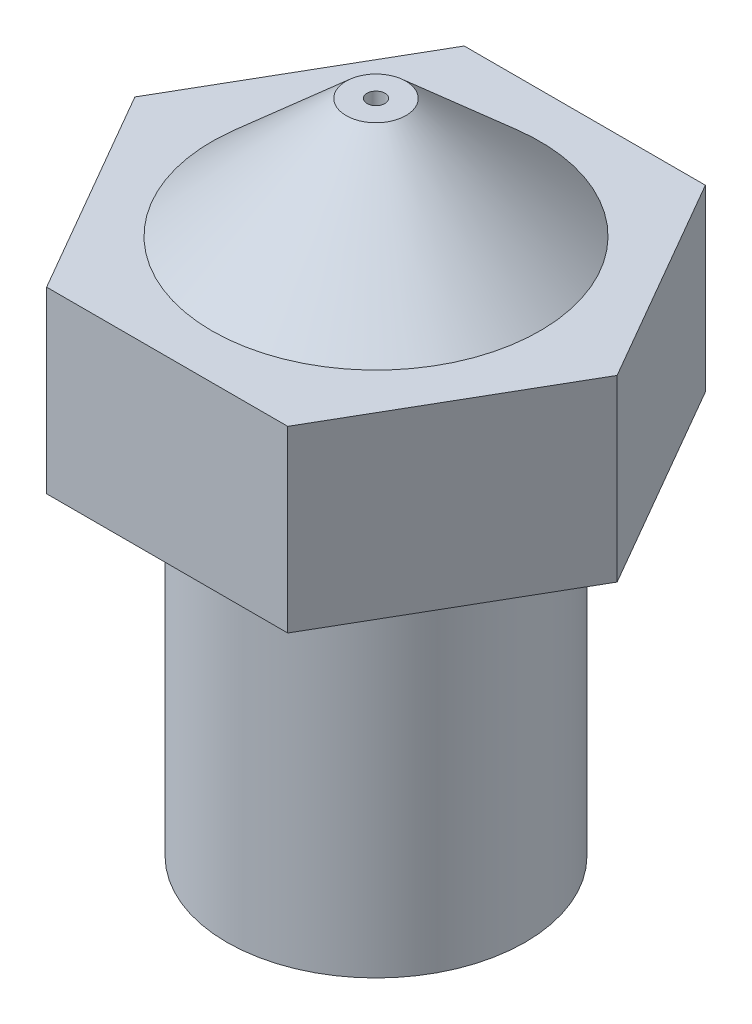
ISO-10303-21;
HEADER;
FILE_DESCRIPTION(('STEP AP214'),'2;1');
FILE_NAME('part.step','',(''),(''),'','','');
FILE_SCHEMA(('AUTOMOTIVE_DESIGN { 1 0 10303 214 1 1 1 1 }'));
ENDSEC;
DATA;
#1=APPLICATION_CONTEXT('core data for automotive mechanical design processes');
#2=APPLICATION_PROTOCOL_DEFINITION('international standard','automotive_design',2000,#1);
#3=PRODUCT_CONTEXT('',#1,'mechanical');
#4=PRODUCT('Part','Part','',(#3));
#5=PRODUCT_RELATED_PRODUCT_CATEGORY('part','',(#4));
#6=PRODUCT_DEFINITION_FORMATION('','',#4);
#7=PRODUCT_DEFINITION_CONTEXT('part definition',#1,'design');
#8=PRODUCT_DEFINITION('design','',#6,#7);
#9=PRODUCT_DEFINITION_SHAPE('','',#8);
#10=(LENGTH_UNIT() NAMED_UNIT(*) SI_UNIT(.MILLI.,.METRE.));
#11=(NAMED_UNIT(*) PLANE_ANGLE_UNIT() SI_UNIT($,.RADIAN.));
#12=(NAMED_UNIT(*) SI_UNIT($,.STERADIAN.) SOLID_ANGLE_UNIT());
#13=UNCERTAINTY_MEASURE_WITH_UNIT(LENGTH_MEASURE(1.E-05),#10,'distance_accuracy_value','');
#14=(GEOMETRIC_REPRESENTATION_CONTEXT(3) GLOBAL_UNCERTAINTY_ASSIGNED_CONTEXT((#13)) GLOBAL_UNIT_ASSIGNED_CONTEXT((#10,
#11,#12)) REPRESENTATION_CONTEXT('',''));
#15=CARTESIAN_POINT('',(0.,0.,0.));
#16=DIRECTION('',(0.,0.,1.));
#17=DIRECTION('',(1.,0.,0.));
#18=AXIS2_PLACEMENT_3D('',#15,#16,#17);
#19=CARTESIAN_POINT('',(2.02072594216373,3.,3.49999999999998));
#20=DIRECTION('',(-0.866025403784441,0.,-0.499999999999995));
#21=DIRECTION('',(-0.499999999999995,0.,0.866025403784442));
#22=AXIS2_PLACEMENT_3D('',#19,#20,#21);
#23=PLANE('',#22);
#24=DIRECTION('',(0.499999999999995,0.,-0.866025403784442));
#25=VECTOR('',#24,1.);
#26=CARTESIAN_POINT('',(2.02072594216373,0.,3.49999999999998));
#27=LINE('',#26,#25);
#28=CARTESIAN_POINT('',(2.02072594216373,0.,3.49999999999998));
#29=VERTEX_POINT('',#28);
#30=CARTESIAN_POINT('',(4.04145188432738,0.,0.));
#31=VERTEX_POINT('',#30);
#32=EDGE_CURVE('E123',#29,#31,#27,.T.);
#33=ORIENTED_EDGE('',*,*,#32,.T.);
#34=DIRECTION('',(0.,-1.,0.));
#35=VECTOR('',#34,1.);
#36=CARTESIAN_POINT('',(4.04145188432738,3.,0.));
#37=LINE('',#36,#35);
#38=CARTESIAN_POINT('',(4.04145188432738,3.,0.));
#39=VERTEX_POINT('',#38);
#40=EDGE_CURVE('E39',#39,#31,#37,.T.);
#41=ORIENTED_EDGE('',*,*,#40,.F.);
#42=DIRECTION('',(0.499999999999995,0.,-0.866025403784442));
#43=VECTOR('',#42,1.);
#44=CARTESIAN_POINT('',(2.02072594216373,3.,3.49999999999998));
#45=LINE('',#44,#43);
#46=CARTESIAN_POINT('',(2.02072594216373,3.,3.49999999999998));
#47=VERTEX_POINT('',#46);
#48=EDGE_CURVE('E134',#47,#39,#45,.T.);
#49=ORIENTED_EDGE('',*,*,#48,.F.);
#50=DIRECTION('',(0.,-1.,0.));
#51=VECTOR('',#50,1.);
#52=CARTESIAN_POINT('',(2.02072594216373,3.,3.49999999999998));
#53=LINE('',#52,#51);
#54=EDGE_CURVE('E119',#47,#29,#53,.T.);
#55=ORIENTED_EDGE('',*,*,#54,.T.);
#56=EDGE_LOOP('',(#33,#41,#49,#55));
#57=FACE_BOUND('',#56,.T.);
#58=ADVANCED_FACE('F36',(#57),#23,.F.);
#59=CARTESIAN_POINT('',(4.04145188432738,3.,0.));
#60=DIRECTION('',(-0.866025403784438,0.,0.500000000000001));
#61=DIRECTION('',(0.500000000000001,0.,0.866025403784438));
#62=AXIS2_PLACEMENT_3D('',#59,#60,#61);
#63=PLANE('',#62);
#64=DIRECTION('',(-0.500000000000001,0.,-0.866025403784438));
#65=VECTOR('',#64,1.);
#66=CARTESIAN_POINT('',(4.04145188432738,0.,0.));
#67=LINE('',#66,#65);
#68=CARTESIAN_POINT('',(2.02072594216368,0.,-3.50000000000001));
#69=VERTEX_POINT('',#68);
#70=EDGE_CURVE('E126',#31,#69,#67,.T.);
#71=ORIENTED_EDGE('',*,*,#70,.T.);
#72=DIRECTION('',(0.,-1.,0.));
#73=VECTOR('',#72,1.);
#74=CARTESIAN_POINT('',(2.02072594216368,3.,-3.50000000000001));
#75=LINE('',#74,#73);
#76=CARTESIAN_POINT('',(2.02072594216368,3.,-3.50000000000001));
#77=VERTEX_POINT('',#76);
#78=EDGE_CURVE('E137',#77,#69,#75,.T.);
#79=ORIENTED_EDGE('',*,*,#78,.F.);
#80=DIRECTION('',(-0.500000000000001,0.,-0.866025403784438));
#81=VECTOR('',#80,1.);
#82=CARTESIAN_POINT('',(4.04145188432738,3.,0.));
#83=LINE('',#82,#81);
#84=EDGE_CURVE('E92',#39,#77,#83,.T.);
#85=ORIENTED_EDGE('',*,*,#84,.F.);
#86=ORIENTED_EDGE('',*,*,#40,.T.);
#87=EDGE_LOOP('',(#71,#79,#85,#86));
#88=FACE_BOUND('',#87,.T.);
#89=ADVANCED_FACE('F154',(#88),#63,.F.);
#90=CARTESIAN_POINT('',(2.02072594216368,3.,-3.50000000000001));
#91=DIRECTION('',(0.,0.,1.));
#92=DIRECTION('',(1.,0.,0.));
#93=AXIS2_PLACEMENT_3D('',#90,#91,#92);
#94=PLANE('',#93);
#95=DIRECTION('',(-1.,0.,0.));
#96=VECTOR('',#95,1.);
#97=CARTESIAN_POINT('',(2.02072594216368,0.,-3.50000000000001));
#98=LINE('',#97,#96);
#99=CARTESIAN_POINT('',(-2.02072594216371,0.,-3.49999999999999));
#100=VERTEX_POINT('',#99);
#101=EDGE_CURVE('E129',#69,#100,#98,.T.);
#102=ORIENTED_EDGE('',*,*,#101,.T.);
#103=DIRECTION('',(0.,-1.,0.));
#104=VECTOR('',#103,1.);
#105=CARTESIAN_POINT('',(-2.02072594216371,3.,-3.49999999999999));
#106=LINE('',#105,#104);
#107=CARTESIAN_POINT('',(-2.02072594216371,3.,-3.49999999999999));
#108=VERTEX_POINT('',#107);
#109=EDGE_CURVE('E114',#108,#100,#106,.T.);
#110=ORIENTED_EDGE('',*,*,#109,.F.);
#111=DIRECTION('',(-1.,0.,0.));
#112=VECTOR('',#111,1.);
#113=CARTESIAN_POINT('',(2.02072594216368,3.,-3.50000000000001));
#114=LINE('',#113,#112);
#115=EDGE_CURVE('E105',#77,#108,#114,.T.);
#116=ORIENTED_EDGE('',*,*,#115,.F.);
#117=ORIENTED_EDGE('',*,*,#78,.T.);
#118=EDGE_LOOP('',(#102,#110,#116,#117));
#119=FACE_BOUND('',#118,.T.);
#120=ADVANCED_FACE('F155',(#119),#94,.F.);
#121=CARTESIAN_POINT('',(-2.02072594216371,3.,-3.49999999999999));
#122=DIRECTION('',(0.866025403784441,0.,0.499999999999995));
#123=DIRECTION('',(0.499999999999995,0.,-0.866025403784442));
#124=AXIS2_PLACEMENT_3D('',#121,#122,#123);
#125=PLANE('',#124);
#126=DIRECTION('',(-0.499999999999995,0.,0.866025403784441));
#127=VECTOR('',#126,1.);
#128=CARTESIAN_POINT('',(-2.02072594216371,0.,-3.49999999999999));
#129=LINE('',#128,#127);
#130=CARTESIAN_POINT('',(-4.04145188432738,0.,0.));
#131=VERTEX_POINT('',#130);
#132=EDGE_CURVE('E113',#100,#131,#129,.T.);
#133=ORIENTED_EDGE('',*,*,#132,.T.);
#134=DIRECTION('',(0.,-1.,0.));
#135=VECTOR('',#134,1.);
#136=CARTESIAN_POINT('',(-4.04145188432738,3.,0.));
#137=LINE('',#136,#135);
#138=CARTESIAN_POINT('',(-4.04145188432738,3.,0.));
#139=VERTEX_POINT('',#138);
#140=EDGE_CURVE('E110',#139,#131,#137,.T.);
#141=ORIENTED_EDGE('',*,*,#140,.F.);
#142=DIRECTION('',(-0.499999999999995,0.,0.866025403784441));
#143=VECTOR('',#142,1.);
#144=CARTESIAN_POINT('',(-2.02072594216371,3.,-3.49999999999999));
#145=LINE('',#144,#143);
#146=EDGE_CURVE('E99',#108,#139,#145,.T.);
#147=ORIENTED_EDGE('',*,*,#146,.F.);
#148=ORIENTED_EDGE('',*,*,#109,.T.);
#149=EDGE_LOOP('',(#133,#141,#147,#148));
#150=FACE_BOUND('',#149,.T.);
#151=ADVANCED_FACE('F111',(#150),#125,.F.);
#152=CARTESIAN_POINT('',(-4.04145188432738,3.,0.));
#153=DIRECTION('',(0.866025403784435,0.,-0.500000000000007));
#154=DIRECTION('',(-0.500000000000007,0.,-0.866025403784434));
#155=AXIS2_PLACEMENT_3D('',#152,#153,#154);
#156=PLANE('',#155);
#157=DIRECTION('',(0.500000000000007,0.,0.866025403784435));
#158=VECTOR('',#157,1.);
#159=CARTESIAN_POINT('',(-4.04145188432738,0.,0.));
#160=LINE('',#159,#158);
#161=CARTESIAN_POINT('',(-2.02072594216366,0.,3.50000000000002));
#162=VERTEX_POINT('',#161);
#163=EDGE_CURVE('E77',#131,#162,#160,.T.);
#164=ORIENTED_EDGE('',*,*,#163,.T.);
#165=DIRECTION('',(0.,-1.,0.));
#166=VECTOR('',#165,1.);
#167=CARTESIAN_POINT('',(-2.02072594216366,3.,3.50000000000002));
#168=LINE('',#167,#166);
#169=CARTESIAN_POINT('',(-2.02072594216366,3.,3.50000000000002));
#170=VERTEX_POINT('',#169);
#171=EDGE_CURVE('E115',#170,#162,#168,.T.);
#172=ORIENTED_EDGE('',*,*,#171,.F.);
#173=DIRECTION('',(0.500000000000007,0.,0.866025403784435));
#174=VECTOR('',#173,1.);
#175=CARTESIAN_POINT('',(-4.04145188432738,3.,0.));
#176=LINE('',#175,#174);
#177=EDGE_CURVE('E103',#139,#170,#176,.T.);
#178=ORIENTED_EDGE('',*,*,#177,.F.);
#179=ORIENTED_EDGE('',*,*,#140,.T.);
#180=EDGE_LOOP('',(#164,#172,#178,#179));
#181=FACE_BOUND('',#180,.T.);
#182=ADVANCED_FACE('F117',(#181),#156,.F.);
#183=CARTESIAN_POINT('',(-2.02072594216366,3.,3.50000000000002));
#184=DIRECTION('',(0.,0.,-1.));
#185=DIRECTION('',(-1.,0.,0.));
#186=AXIS2_PLACEMENT_3D('',#183,#184,#185);
#187=PLANE('',#186);
#188=DIRECTION('',(1.,0.,0.));
#189=VECTOR('',#188,1.);
#190=CARTESIAN_POINT('',(-2.02072594216366,0.,3.50000000000002));
#191=LINE('',#190,#189);
#192=EDGE_CURVE('E83',#162,#29,#191,.T.);
#193=ORIENTED_EDGE('',*,*,#192,.T.);
#194=ORIENTED_EDGE('',*,*,#54,.F.);
#195=DIRECTION('',(1.,0.,0.));
#196=VECTOR('',#195,1.);
#197=CARTESIAN_POINT('',(-2.02072594216366,3.,3.50000000000002));
#198=LINE('',#197,#196);
#199=EDGE_CURVE('E54',#170,#47,#198,.T.);
#200=ORIENTED_EDGE('',*,*,#199,.F.);
#201=ORIENTED_EDGE('',*,*,#171,.T.);
#202=EDGE_LOOP('',(#193,#194,#200,#201));
#203=FACE_BOUND('',#202,.T.);
#204=ADVANCED_FACE('F160',(#203),#187,.F.);
#205=CARTESIAN_POINT('',(0.,3.,0.));
#206=DIRECTION('',(0.,1.,0.));
#207=DIRECTION('',(0.,0.,1.));
#208=AXIS2_PLACEMENT_3D('',#205,#206,#207);
#209=PLANE('',#208);
#210=CARTESIAN_POINT('',(0.,3.,0.));
#211=DIRECTION('',(0.,1.,0.));
#212=DIRECTION('',(0.,0.,1.));
#213=AXIS2_PLACEMENT_3D('',#210,#211,#212);
#214=CIRCLE('',#213,2.75);
#215=CARTESIAN_POINT('',(0.,3.,2.75));
#216=VERTEX_POINT('',#215);
#217=EDGE_CURVE('E45',#216,#216,#214,.T.);
#218=ORIENTED_EDGE('',*,*,#217,.F.);
#219=EDGE_LOOP('',(#218));
#220=FACE_BOUND('',#219,.T.);
#221=ORIENTED_EDGE('',*,*,#48,.T.);
#222=ORIENTED_EDGE('',*,*,#84,.T.);
#223=ORIENTED_EDGE('',*,*,#115,.T.);
#224=ORIENTED_EDGE('',*,*,#146,.T.);
#225=ORIENTED_EDGE('',*,*,#177,.T.);
#226=ORIENTED_EDGE('',*,*,#199,.T.);
#227=EDGE_LOOP('',(#221,#222,#223,#224,#225,#226));
#228=FACE_BOUND('',#227,.T.);
#229=ADVANCED_FACE('F101',(#220,#228),#209,.T.);
#230=CARTESIAN_POINT('',(0.,0.,0.));
#231=DIRECTION('',(0.,1.,0.));
#232=DIRECTION('',(0.,0.,1.));
#233=AXIS2_PLACEMENT_3D('',#230,#231,#232);
#234=PLANE('',#233);
#235=CARTESIAN_POINT('',(0.,0.,0.));
#236=DIRECTION('',(0.,-1.,0.));
#237=DIRECTION('',(0.,0.,-1.));
#238=AXIS2_PLACEMENT_3D('',#235,#236,#237);
#239=CIRCLE('',#238,2.5);
#240=CARTESIAN_POINT('',(0.,0.,-2.5));
#241=VERTEX_POINT('',#240);
#242=EDGE_CURVE('E11',#241,#241,#239,.T.);
#243=ORIENTED_EDGE('',*,*,#242,.F.);
#244=EDGE_LOOP('',(#243));
#245=FACE_BOUND('',#244,.T.);
#246=ORIENTED_EDGE('',*,*,#32,.F.);
#247=ORIENTED_EDGE('',*,*,#192,.F.);
#248=ORIENTED_EDGE('',*,*,#163,.F.);
#249=ORIENTED_EDGE('',*,*,#132,.F.);
#250=ORIENTED_EDGE('',*,*,#101,.F.);
#251=ORIENTED_EDGE('',*,*,#70,.F.);
#252=EDGE_LOOP('',(#246,#247,#248,#249,#250,#251));
#253=FACE_BOUND('',#252,.T.);
#254=ADVANCED_FACE('F158',(#245,#253),#234,.F.);
#255=CARTESIAN_POINT('',(0.,3.,0.));
#256=DIRECTION('',(0.,-1.,0.));
#257=DIRECTION('',(0.,0.,1.));
#258=AXIS2_PLACEMENT_3D('',#255,#256,#257);
#259=CONICAL_SURFACE('',#258,2.75,0.84404122626446);
#260=CARTESIAN_POINT('',(0.,5.,0.));
#261=DIRECTION('',(0.,1.,0.));
#262=DIRECTION('',(0.,0.,1.));
#263=AXIS2_PLACEMENT_3D('',#260,#261,#262);
#264=CIRCLE('',#263,0.500510878259264);
#265=CARTESIAN_POINT('',(0.,5.,0.500510878259264));
#266=VERTEX_POINT('',#265);
#267=EDGE_CURVE('E127',#266,#266,#264,.T.);
#268=CARTESIAN_POINT('',(0.,5.,0.500510878259264));
#269=CARTESIAN_POINT('',(0.,4.97916666666667,0.52394305661073));
#270=CARTESIAN_POINT('',(0.,4.95833333333333,0.547375234962196));
#271=CARTESIAN_POINT('',(0.,4.91666666666667,0.594239591665128));
#272=CARTESIAN_POINT('',(0.,4.89583333333333,0.617671770016594));
#273=CARTESIAN_POINT('',(0.,4.85416666666667,0.664536126719526));
#274=CARTESIAN_POINT('',(0.,4.83333333333333,0.687968305070992));
#275=CARTESIAN_POINT('',(0.,4.79166666666667,0.734832661773924));
#276=CARTESIAN_POINT('',(0.,4.77083333333333,0.75826484012539));
#277=CARTESIAN_POINT('',(0.,4.72916666666667,0.805129196828322));
#278=CARTESIAN_POINT('',(0.,4.70833333333333,0.828561375179788));
#279=CARTESIAN_POINT('',(0.,4.66666666666667,0.87542573188272));
#280=CARTESIAN_POINT('',(0.,4.64583333333333,0.898857910234186));
#281=CARTESIAN_POINT('',(0.,4.60416666666667,0.945722266937118));
#282=CARTESIAN_POINT('',(0.,4.58333333333333,0.969154445288584));
#283=CARTESIAN_POINT('',(0.,4.54166666666667,1.01601880199152));
#284=CARTESIAN_POINT('',(0.,4.52083333333333,1.03945098034298));
#285=CARTESIAN_POINT('',(0.,4.47916666666667,1.08631533704591));
#286=CARTESIAN_POINT('',(0.,4.45833333333333,1.10974751539738));
#287=CARTESIAN_POINT('',(0.,4.41666666666667,1.15661187210031));
#288=CARTESIAN_POINT('',(0.,4.39583333333333,1.18004405045178));
#289=CARTESIAN_POINT('',(0.,4.35416666666667,1.22690840715471));
#290=CARTESIAN_POINT('',(0.,4.33333333333333,1.25034058550618));
#291=CARTESIAN_POINT('',(0.,4.29166666666667,1.29720494220911));
#292=CARTESIAN_POINT('',(0.,4.27083333333333,1.32063712056057));
#293=CARTESIAN_POINT('',(0.,4.22916666666667,1.36750147726351));
#294=CARTESIAN_POINT('',(0.,4.20833333333333,1.39093365561497));
#295=CARTESIAN_POINT('',(0.,4.16666666666667,1.4377980123179));
#296=CARTESIAN_POINT('',(0.,4.14583333333333,1.46123019066937));
#297=CARTESIAN_POINT('',(0.,4.10416666666667,1.5080945473723));
#298=CARTESIAN_POINT('',(0.,4.08333333333333,1.53152672572377));
#299=CARTESIAN_POINT('',(0.,4.04166666666667,1.5783910824267));
#300=CARTESIAN_POINT('',(0.,4.02083333333333,1.60182326077817));
#301=CARTESIAN_POINT('',(0.,3.97916666666667,1.6486876174811));
#302=CARTESIAN_POINT('',(0.,3.95833333333333,1.67211979583256));
#303=CARTESIAN_POINT('',(0.,3.91666666666667,1.7189841525355));
#304=CARTESIAN_POINT('',(0.,3.89583333333333,1.74241633088696));
#305=CARTESIAN_POINT('',(0.,3.85416666666667,1.78928068758989));
#306=CARTESIAN_POINT('',(0.,3.83333333333333,1.81271286594136));
#307=CARTESIAN_POINT('',(0.,3.79166666666667,1.85957722264429));
#308=CARTESIAN_POINT('',(0.,3.77083333333333,1.88300940099576));
#309=CARTESIAN_POINT('',(0.,3.72916666666667,1.92987375769869));
#310=CARTESIAN_POINT('',(0.,3.70833333333333,1.95330593605016));
#311=CARTESIAN_POINT('',(0.,3.66666666666667,2.00017029275309));
#312=CARTESIAN_POINT('',(0.,3.64583333333333,2.02360247110455));
#313=CARTESIAN_POINT('',(0.,3.60416666666667,2.07046682780749));
#314=CARTESIAN_POINT('',(0.,3.58333333333333,2.09389900615895));
#315=CARTESIAN_POINT('',(0.,3.54166666666667,2.14076336286188));
#316=CARTESIAN_POINT('',(0.,3.52083333333333,2.16419554121335));
#317=CARTESIAN_POINT('',(0.,3.47916666666667,2.21105989791628));
#318=CARTESIAN_POINT('',(0.,3.45833333333333,2.23449207626775));
#319=CARTESIAN_POINT('',(0.,3.41666666666667,2.28135643297068));
#320=CARTESIAN_POINT('',(0.,3.39583333333333,2.30478861132215));
#321=CARTESIAN_POINT('',(0.,3.35416666666667,2.35165296802508));
#322=CARTESIAN_POINT('',(0.,3.33333333333333,2.37508514637654));
#323=CARTESIAN_POINT('',(0.,3.29166666666667,2.42194950307948));
#324=CARTESIAN_POINT('',(0.,3.27083333333333,2.44538168143094));
#325=CARTESIAN_POINT('',(0.,3.22916666666667,2.49224603813387));
#326=CARTESIAN_POINT('',(0.,3.20833333333333,2.51567821648534));
#327=CARTESIAN_POINT('',(0.,3.16666666666667,2.56254257318827));
#328=CARTESIAN_POINT('',(0.,3.14583333333333,2.58597475153974));
#329=CARTESIAN_POINT('',(0.,3.10416666666667,2.63283910824267));
#330=CARTESIAN_POINT('',(0.,3.08333333333333,2.65627128659414));
#331=CARTESIAN_POINT('',(0.,3.04166666666667,2.70313564329707));
#332=CARTESIAN_POINT('',(0.,3.02083333333333,2.72656782164853));
#333=CARTESIAN_POINT('',(0.,3.,2.75));
#334=B_SPLINE_CURVE_WITH_KNOTS('',3,(#268,#269,#270,#271,#272,#273,#274,#275,#276,#277,#278,
#279,#280,#281,#282,#283,#284,#285,#286,#287,#288,#289,#290,#291,#292,#293,#294,#295,#296,#297,
#298,#299,#300,#301,#302,#303,#304,#305,#306,#307,#308,#309,#310,#311,#312,#313,#314,#315,#316,
#317,#318,#319,#320,#321,#322,#323,#324,#325,#326,#327,#328,#329,#330,#331,#332,#333),
.UNSPECIFIED.,.F.,.F.,(4,2,2,2,2,2,2,2,2,2,2,2,2,2,2,2,2,2,2,2,2,2,2,2,2,2,2,2,2,2,2,2,4),(0.,
0.0940630258956951,0.18812605179139,0.282189077687086,0.376252103582781,0.470315129478476,
0.564378155374171,0.658441181269866,0.752504207165561,0.846567233061256,0.940630258956951,
1.03469328485265,1.12875631074834,1.22281933664404,1.31688236253973,1.41094538843543,
1.50500841433112,1.59907144022682,1.69313446612251,1.78719749201821,1.8812605179139,
1.9753235438096,2.06938656970529,2.16344959560099,2.25751262149668,2.35157564739238,
2.44563867328807,2.53970169918377,2.63376472507946,2.72782775097516,2.82189077687085,
2.91595380276655,3.01001682866224),.UNSPECIFIED.);
#335=EDGE_CURVE('BSEAM206',#266,#216,#334,.T.);
#336=ORIENTED_EDGE('',*,*,#267,.F.);
#337=ORIENTED_EDGE('',*,*,#217,.T.);
#338=ORIENTED_EDGE('',*,*,#335,.T.);
#339=ORIENTED_EDGE('',*,*,#335,.F.);
#340=EDGE_LOOP('',(#336,#338,#337,#339));
#341=FACE_BOUND('',#340,.T.);
#342=ADVANCED_FACE('F206',(#341),#259,.T.);
#343=CARTESIAN_POINT('',(0.,5.,0.));
#344=DIRECTION('',(0.,1.,0.));
#345=DIRECTION('',(0.,0.,1.));
#346=AXIS2_PLACEMENT_3D('',#343,#344,#345);
#347=PLANE('',#346);
#348=CARTESIAN_POINT('',(0.,5.,0.));
#349=DIRECTION('',(0.,1.,0.));
#350=DIRECTION('',(0.,0.,1.));
#351=AXIS2_PLACEMENT_3D('',#348,#349,#350);
#352=CIRCLE('',#351,0.15);
#353=CARTESIAN_POINT('',(0.,5.,0.15));
#354=VERTEX_POINT('',#353);
#355=EDGE_CURVE('E148',#354,#354,#352,.T.);
#356=ORIENTED_EDGE('',*,*,#355,.F.);
#357=EDGE_LOOP('',(#356));
#358=FACE_BOUND('',#357,.T.);
#359=ORIENTED_EDGE('',*,*,#267,.T.);
#360=EDGE_LOOP('',(#359));
#361=FACE_BOUND('',#360,.T.);
#362=ADVANCED_FACE('F211',(#358,#361),#347,.T.);
#363=CARTESIAN_POINT('',(0.,3.5,0.));
#364=DIRECTION('',(0.,1.,0.));
#365=DIRECTION('',(0.,0.,1.));
#366=AXIS2_PLACEMENT_3D('',#363,#364,#365);
#367=CYLINDRICAL_SURFACE('',#366,0.15);
#368=CARTESIAN_POINT('',(0.,3.5,0.));
#369=DIRECTION('',(0.,1.,0.));
#370=DIRECTION('',(0.,0.,1.));
#371=AXIS2_PLACEMENT_3D('',#368,#369,#370);
#372=CIRCLE('',#371,0.15);
#373=CARTESIAN_POINT('',(0.,3.5,0.15));
#374=VERTEX_POINT('',#373);
#375=EDGE_CURVE('E289',#374,#374,#372,.T.);
#376=ORIENTED_EDGE('',*,*,#375,.F.);
#377=EDGE_LOOP('',(#376));
#378=FACE_BOUND('',#377,.T.);
#379=ORIENTED_EDGE('',*,*,#355,.T.);
#380=EDGE_LOOP('',(#379));
#381=FACE_BOUND('',#380,.T.);
#382=ADVANCED_FACE('F221',(#378,#381),#367,.F.);
#383=CARTESIAN_POINT('',(0.,-6.,0.));
#384=DIRECTION('',(0.,1.,0.));
#385=DIRECTION('',(0.,0.,1.));
#386=AXIS2_PLACEMENT_3D('',#383,#384,#385);
#387=CYLINDRICAL_SURFACE('',#386,2.5);
#388=CARTESIAN_POINT('',(0.,-6.,0.));
#389=DIRECTION('',(0.,-1.,0.));
#390=DIRECTION('',(0.,0.,-1.));
#391=AXIS2_PLACEMENT_3D('',#388,#389,#390);
#392=CIRCLE('',#391,2.5);
#393=CARTESIAN_POINT('',(0.,-6.,-2.5));
#394=VERTEX_POINT('',#393);
#395=EDGE_CURVE('E292',#394,#394,#392,.T.);
#396=ORIENTED_EDGE('',*,*,#395,.F.);
#397=EDGE_LOOP('',(#396));
#398=FACE_BOUND('',#397,.T.);
#399=ORIENTED_EDGE('',*,*,#242,.T.);
#400=EDGE_LOOP('',(#399));
#401=FACE_BOUND('',#400,.T.);
#402=ADVANCED_FACE('F231',(#398,#401),#387,.T.);
#403=CARTESIAN_POINT('',(0.,-6.,0.));
#404=DIRECTION('',(0.,-1.,0.));
#405=DIRECTION('',(0.,0.,-1.));
#406=AXIS2_PLACEMENT_3D('',#403,#404,#405);
#407=PLANE('',#406);
#408=CARTESIAN_POINT('',(0.,-6.,0.));
#409=DIRECTION('',(0.,-1.,0.));
#410=DIRECTION('',(0.,0.,-1.));
#411=AXIS2_PLACEMENT_3D('',#408,#409,#410);
#412=CIRCLE('',#411,1.);
#413=CARTESIAN_POINT('',(0.,-6.,-1.));
#414=VERTEX_POINT('',#413);
#415=EDGE_CURVE('E284',#414,#414,#412,.T.);
#416=ORIENTED_EDGE('',*,*,#415,.F.);
#417=EDGE_LOOP('',(#416));
#418=FACE_BOUND('',#417,.T.);
#419=ORIENTED_EDGE('',*,*,#395,.T.);
#420=EDGE_LOOP('',(#419));
#421=FACE_BOUND('',#420,.T.);
#422=ADVANCED_FACE('F247',(#418,#421),#407,.T.);
#423=CARTESIAN_POINT('',(0.,3.5,0.));
#424=DIRECTION('',(0.,1.,0.));
#425=DIRECTION('',(0.,0.,1.));
#426=AXIS2_PLACEMENT_3D('',#423,#424,#425);
#427=PLANE('',#426);
#428=ORIENTED_EDGE('',*,*,#375,.T.);
#429=EDGE_LOOP('',(#428));
#430=FACE_BOUND('',#429,.T.);
#431=CARTESIAN_POINT('',(0.,3.5,0.));
#432=DIRECTION('',(0.,1.,0.));
#433=DIRECTION('',(0.,0.,1.));
#434=AXIS2_PLACEMENT_3D('',#431,#432,#433);
#435=CIRCLE('',#434,1.);
#436=CARTESIAN_POINT('',(0.,3.5,1.));
#437=VERTEX_POINT('',#436);
#438=EDGE_CURVE('E287',#437,#437,#435,.F.);
#439=ORIENTED_EDGE('',*,*,#438,.T.);
#440=EDGE_LOOP('',(#439));
#441=FACE_BOUND('',#440,.T.);
#442=ADVANCED_FACE('F257',(#430,#441),#427,.F.);
#443=CARTESIAN_POINT('',(0.,6.32842712474619,0.));
#444=DIRECTION('',(0.,-1.,0.));
#445=DIRECTION('',(0.,0.,-1.));
#446=AXIS2_PLACEMENT_3D('',#443,#444,#445);
#447=CYLINDRICAL_SURFACE('',#446,1.);
#448=ORIENTED_EDGE('',*,*,#415,.T.);
#449=EDGE_LOOP('',(#448));
#450=FACE_BOUND('',#449,.T.);
#451=ORIENTED_EDGE('',*,*,#438,.F.);
#452=EDGE_LOOP('',(#451));
#453=FACE_BOUND('',#452,.T.);
#454=ADVANCED_FACE('F267',(#450,#453),#447,.F.);
#455=CLOSED_SHELL('',(#58,#89,#120,#151,#182,#204,#229,#254,#342,#362,#382,#402,#422,#442,#454));
#456=MANIFOLD_SOLID_BREP('B2',#455);
#457=ADVANCED_BREP_SHAPE_REPRESENTATION('',(#18,#456),#14);
#458=SHAPE_DEFINITION_REPRESENTATION(#9,#457);
ENDSEC;
END-ISO-10303-21;
